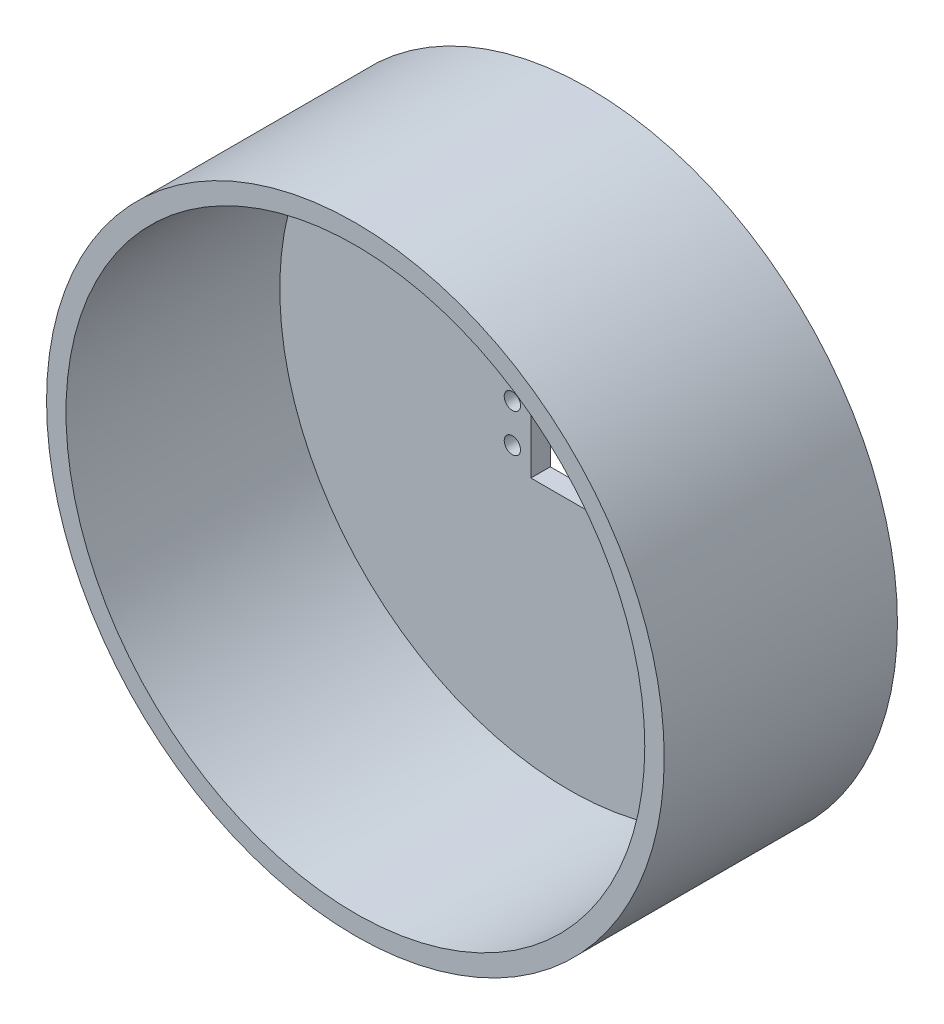
ISO-10303-21;
HEADER;
FILE_DESCRIPTION(('STEP AP214'),'2;1');
FILE_NAME('part.step','',(''),(''),'','','');
FILE_SCHEMA(('AUTOMOTIVE_DESIGN { 1 0 10303 214 1 1 1 1 }'));
ENDSEC;
DATA;
#1=APPLICATION_CONTEXT('core data for automotive mechanical design processes');
#2=APPLICATION_PROTOCOL_DEFINITION('international standard','automotive_design',2000,#1);
#3=PRODUCT_CONTEXT('',#1,'mechanical');
#4=PRODUCT('Part','Part','',(#3));
#5=PRODUCT_RELATED_PRODUCT_CATEGORY('part','',(#4));
#6=PRODUCT_DEFINITION_FORMATION('','',#4);
#7=PRODUCT_DEFINITION_CONTEXT('part definition',#1,'design');
#8=PRODUCT_DEFINITION('design','',#6,#7);
#9=PRODUCT_DEFINITION_SHAPE('','',#8);
#10=(LENGTH_UNIT() NAMED_UNIT(*) SI_UNIT(.MILLI.,.METRE.));
#11=(NAMED_UNIT(*) PLANE_ANGLE_UNIT() SI_UNIT($,.RADIAN.));
#12=(NAMED_UNIT(*) SI_UNIT($,.STERADIAN.) SOLID_ANGLE_UNIT());
#13=UNCERTAINTY_MEASURE_WITH_UNIT(LENGTH_MEASURE(1.E-05),#10,'distance_accuracy_value','');
#14=(GEOMETRIC_REPRESENTATION_CONTEXT(3) GLOBAL_UNCERTAINTY_ASSIGNED_CONTEXT((#13)) GLOBAL_UNIT_ASSIGNED_CONTEXT((#10,
#11,#12)) REPRESENTATION_CONTEXT('',''));
#15=CARTESIAN_POINT('',(0.,0.,0.));
#16=DIRECTION('',(0.,0.,1.));
#17=DIRECTION('',(1.,0.,0.));
#18=AXIS2_PLACEMENT_3D('',#15,#16,#17);
#19=CARTESIAN_POINT('',(0.,0.,60.));
#20=DIRECTION('',(0.,0.,-1.));
#21=DIRECTION('',(-1.,0.,0.));
#22=AXIS2_PLACEMENT_3D('',#19,#20,#21);
#23=CYLINDRICAL_SURFACE('',#22,79.45);
#24=CARTESIAN_POINT('',(0.,0.,60.));
#25=DIRECTION('',(0.,0.,1.));
#26=DIRECTION('',(1.,0.,0.));
#27=AXIS2_PLACEMENT_3D('',#24,#25,#26);
#28=CIRCLE('',#27,79.45);
#29=CARTESIAN_POINT('',(79.45,0.,60.));
#30=VERTEX_POINT('',#29);
#31=EDGE_CURVE('E115',#30,#30,#28,.T.);
#32=ORIENTED_EDGE('',*,*,#31,.F.);
#33=EDGE_LOOP('',(#32));
#34=FACE_BOUND('',#33,.T.);
#35=CARTESIAN_POINT('',(0.,0.,0.));
#36=DIRECTION('',(0.,0.,1.));
#37=DIRECTION('',(1.,0.,0.));
#38=AXIS2_PLACEMENT_3D('',#35,#36,#37);
#39=CIRCLE('',#38,79.45);
#40=CARTESIAN_POINT('',(79.45,0.,0.));
#41=VERTEX_POINT('',#40);
#42=EDGE_CURVE('E114',#41,#41,#39,.T.);
#43=ORIENTED_EDGE('',*,*,#42,.T.);
#44=EDGE_LOOP('',(#43));
#45=FACE_BOUND('',#44,.T.);
#46=ADVANCED_FACE('F38',(#34,#45),#23,.T.);
#47=CARTESIAN_POINT('',(0.,0.,60.));
#48=DIRECTION('',(0.,0.,1.));
#49=DIRECTION('',(1.,0.,0.));
#50=AXIS2_PLACEMENT_3D('',#47,#48,#49);
#51=PLANE('',#50);
#52=CARTESIAN_POINT('',(0.,0.,60.));
#53=DIRECTION('',(0.,0.,1.));
#54=DIRECTION('',(1.,0.,0.));
#55=AXIS2_PLACEMENT_3D('',#52,#53,#54);
#56=CIRCLE('',#55,74.45);
#57=CARTESIAN_POINT('',(74.45,0.,60.));
#58=VERTEX_POINT('',#57);
#59=EDGE_CURVE('E111',#58,#58,#56,.T.);
#60=ORIENTED_EDGE('',*,*,#59,.F.);
#61=EDGE_LOOP('',(#60));
#62=FACE_BOUND('',#61,.T.);
#63=ORIENTED_EDGE('',*,*,#31,.T.);
#64=EDGE_LOOP('',(#63));
#65=FACE_BOUND('',#64,.T.);
#66=ADVANCED_FACE('F161',(#62,#65),#51,.T.);
#67=CARTESIAN_POINT('',(0.,0.,0.));
#68=DIRECTION('',(0.,0.,1.));
#69=DIRECTION('',(1.,0.,0.));
#70=AXIS2_PLACEMENT_3D('',#67,#68,#69);
#71=PLANE('',#70);
#72=CARTESIAN_POINT('',(-14.611895649818,4.92277429801889,0.));
#73=DIRECTION('',(0.,0.,-1.));
#74=DIRECTION('',(-1.,0.,0.));
#75=AXIS2_PLACEMENT_3D('',#72,#73,#74);
#76=CIRCLE('',#75,2.10000000000001);
#77=CARTESIAN_POINT('',(-16.711895649818,4.92277429801889,0.));
#78=VERTEX_POINT('',#77);
#79=EDGE_CURVE('E276',#78,#78,#76,.T.);
#80=ORIENTED_EDGE('',*,*,#79,.F.);
#81=EDGE_LOOP('',(#80));
#82=FACE_BOUND('',#81,.T.);
#83=CARTESIAN_POINT('',(-14.6103952471607,-4.92722558770659,0.));
#84=DIRECTION('',(0.,0.,-1.));
#85=DIRECTION('',(-1.,0.,0.));
#86=AXIS2_PLACEMENT_3D('',#83,#84,#85);
#87=CIRCLE('',#86,2.10000000000001);
#88=CARTESIAN_POINT('',(-16.7103952471607,-4.92722558770659,0.));
#89=VERTEX_POINT('',#88);
#90=EDGE_CURVE('E273',#89,#89,#87,.T.);
#91=ORIENTED_EDGE('',*,*,#90,.F.);
#92=EDGE_LOOP('',(#91));
#93=FACE_BOUND('',#92,.T.);
#94=CARTESIAN_POINT('',(34.8118954154682,-4.91969733013279,0.));
#95=DIRECTION('',(0.,0.,-1.));
#96=DIRECTION('',(-1.,0.,0.));
#97=AXIS2_PLACEMENT_3D('',#94,#95,#96);
#98=CIRCLE('',#97,2.10000000000001);
#99=CARTESIAN_POINT('',(32.7118954154681,-4.91969733013279,0.));
#100=VERTEX_POINT('',#99);
#101=EDGE_CURVE('E275',#100,#100,#98,.T.);
#102=ORIENTED_EDGE('',*,*,#101,.F.);
#103=EDGE_LOOP('',(#102));
#104=FACE_BOUND('',#103,.T.);
#105=CARTESIAN_POINT('',(34.8103950128108,4.93030255559268,0.));
#106=DIRECTION('',(0.,0.,-1.));
#107=DIRECTION('',(-1.,0.,0.));
#108=AXIS2_PLACEMENT_3D('',#105,#106,#107);
#109=CIRCLE('',#108,2.10000000000001);
#110=CARTESIAN_POINT('',(32.7103950128108,4.93030255559268,0.));
#111=VERTEX_POINT('',#110);
#112=EDGE_CURVE('E279',#111,#111,#109,.T.);
#113=ORIENTED_EDGE('',*,*,#112,.F.);
#114=EDGE_LOOP('',(#113));
#115=FACE_BOUND('',#114,.T.);
#116=DIRECTION('',(-0.999999988398525,-0.000152325142876257,0.));
#117=VECTOR('',#116,1.);
#118=CARTESIAN_POINT('',(-9.85145459083999,-9.85150073852003,0.));
#119=LINE('',#118,#117);
#120=CARTESIAN_POINT('',(30.051500054033,-9.84542251518205,0.));
#121=VERTEX_POINT('',#120);
#122=CARTESIAN_POINT('',(-9.85145459083999,-9.85150073852003,0.));
#123=VERTEX_POINT('',#122);
#124=EDGE_CURVE('E91',#121,#123,#119,.T.);
#125=ORIENTED_EDGE('',*,*,#124,.F.);
#126=DIRECTION('',(0.000152325142875524,-0.999999988398525,0.));
#127=VECTOR('',#126,1.);
#128=CARTESIAN_POINT('',(30.051500054033,-9.84542251518205,0.));
#129=LINE('',#128,#127);
#130=CARTESIAN_POINT('',(30.0484992487183,9.8545772562689,0.));
#131=VERTEX_POINT('',#130);
#132=EDGE_CURVE('E54',#131,#121,#129,.T.);
#133=ORIENTED_EDGE('',*,*,#132,.F.);
#134=DIRECTION('',(0.999999988398525,0.0001523251428762,0.));
#135=VECTOR('',#134,1.);
#136=CARTESIAN_POINT('',(30.0484992487183,9.8545772562689,0.));
#137=LINE('',#136,#135);
#138=CARTESIAN_POINT('',(-9.85145459083999,9.84849949002903,0.));
#139=VERTEX_POINT('',#138);
#140=EDGE_CURVE('E98',#139,#131,#137,.T.);
#141=ORIENTED_EDGE('',*,*,#140,.F.);
#142=DIRECTION('',(0.,1.,0.));
#143=VECTOR('',#142,1.);
#144=CARTESIAN_POINT('',(-9.85145459083999,9.84849949002903,0.));
#145=LINE('',#144,#143);
#146=EDGE_CURVE('E82',#123,#139,#145,.T.);
#147=ORIENTED_EDGE('',*,*,#146,.F.);
#148=EDGE_LOOP('',(#125,#133,#141,#147));
#149=FACE_BOUND('',#148,.T.);
#150=ORIENTED_EDGE('',*,*,#42,.F.);
#151=EDGE_LOOP('',(#150));
#152=FACE_BOUND('',#151,.T.);
#153=ADVANCED_FACE('F95',(#82,#93,#104,#115,#149,#152),#71,.F.);
#154=CARTESIAN_POINT('',(0.,0.,60.));
#155=DIRECTION('',(0.,0.,-1.));
#156=DIRECTION('',(-1.,0.,0.));
#157=AXIS2_PLACEMENT_3D('',#154,#155,#156);
#158=CYLINDRICAL_SURFACE('',#157,74.45);
#159=ORIENTED_EDGE('',*,*,#59,.T.);
#160=EDGE_LOOP('',(#159));
#161=FACE_BOUND('',#160,.T.);
#162=CARTESIAN_POINT('',(0.,0.,5.));
#163=DIRECTION('',(0.,0.,1.));
#164=DIRECTION('',(1.,0.,0.));
#165=AXIS2_PLACEMENT_3D('',#162,#163,#164);
#166=CIRCLE('',#165,74.45);
#167=CARTESIAN_POINT('',(74.45,0.,5.));
#168=VERTEX_POINT('',#167);
#169=EDGE_CURVE('E108',#168,#168,#166,.T.);
#170=ORIENTED_EDGE('',*,*,#169,.F.);
#171=EDGE_LOOP('',(#170));
#172=FACE_BOUND('',#171,.T.);
#173=ADVANCED_FACE('F142',(#161,#172),#158,.F.);
#174=CARTESIAN_POINT('',(0.,0.,5.));
#175=DIRECTION('',(0.,0.,1.));
#176=DIRECTION('',(1.,0.,0.));
#177=AXIS2_PLACEMENT_3D('',#174,#175,#176);
#178=PLANE('',#177);
#179=CARTESIAN_POINT('',(-14.611895649818,4.92277429801889,5.));
#180=DIRECTION('',(0.,0.,1.));
#181=DIRECTION('',(1.,0.,0.));
#182=AXIS2_PLACEMENT_3D('',#179,#180,#181);
#183=CIRCLE('',#182,2.10000000000001);
#184=CARTESIAN_POINT('',(-12.511895649818,4.92277429801889,5.));
#185=VERTEX_POINT('',#184);
#186=EDGE_CURVE('E41',#185,#185,#183,.T.);
#187=ORIENTED_EDGE('',*,*,#186,.F.);
#188=EDGE_LOOP('',(#187));
#189=FACE_BOUND('',#188,.T.);
#190=CARTESIAN_POINT('',(-14.6103952471607,-4.92722558770659,5.));
#191=DIRECTION('',(0.,0.,1.));
#192=DIRECTION('',(1.,0.,0.));
#193=AXIS2_PLACEMENT_3D('',#190,#191,#192);
#194=CIRCLE('',#193,2.10000000000001);
#195=CARTESIAN_POINT('',(-12.5103952471607,-4.92722558770659,5.));
#196=VERTEX_POINT('',#195);
#197=EDGE_CURVE('E128',#196,#196,#194,.T.);
#198=ORIENTED_EDGE('',*,*,#197,.F.);
#199=EDGE_LOOP('',(#198));
#200=FACE_BOUND('',#199,.T.);
#201=CARTESIAN_POINT('',(34.8118954154682,-4.91969733013279,5.));
#202=DIRECTION('',(0.,0.,1.));
#203=DIRECTION('',(1.,0.,0.));
#204=AXIS2_PLACEMENT_3D('',#201,#202,#203);
#205=CIRCLE('',#204,2.10000000000001);
#206=CARTESIAN_POINT('',(36.9118954154682,-4.91969733013279,5.));
#207=VERTEX_POINT('',#206);
#208=EDGE_CURVE('E126',#207,#207,#205,.T.);
#209=ORIENTED_EDGE('',*,*,#208,.F.);
#210=EDGE_LOOP('',(#209));
#211=FACE_BOUND('',#210,.T.);
#212=CARTESIAN_POINT('',(34.8103950128108,4.93030255559268,5.));
#213=DIRECTION('',(0.,0.,1.));
#214=DIRECTION('',(1.,0.,0.));
#215=AXIS2_PLACEMENT_3D('',#212,#213,#214);
#216=CIRCLE('',#215,2.10000000000001);
#217=CARTESIAN_POINT('',(36.9103950128108,4.93030255559268,5.));
#218=VERTEX_POINT('',#217);
#219=EDGE_CURVE('E105',#218,#218,#216,.T.);
#220=ORIENTED_EDGE('',*,*,#219,.F.);
#221=EDGE_LOOP('',(#220));
#222=FACE_BOUND('',#221,.T.);
#223=DIRECTION('',(-0.000152325142875524,0.999999988398525,0.));
#224=VECTOR('',#223,1.);
#225=CARTESIAN_POINT('',(30.0499996513756,0.0045773705434095,5.));
#226=LINE('',#225,#224);
#227=CARTESIAN_POINT('',(30.051500054033,-9.84542251518205,5.));
#228=VERTEX_POINT('',#227);
#229=CARTESIAN_POINT('',(30.0484992487183,9.8545772562689,5.));
#230=VERTEX_POINT('',#229);
#231=EDGE_CURVE('E11',#228,#230,#226,.T.);
#232=ORIENTED_EDGE('',*,*,#231,.F.);
#233=DIRECTION('',(0.999999988398525,0.000152325142876257,0.));
#234=VECTOR('',#233,1.);
#235=CARTESIAN_POINT('',(0.00150040265733113,-9.84999988572548,5.));
#236=LINE('',#235,#234);
#237=CARTESIAN_POINT('',(-9.85145459083999,-9.85150073852003,5.));
#238=VERTEX_POINT('',#237);
#239=EDGE_CURVE('E118',#238,#228,#236,.T.);
#240=ORIENTED_EDGE('',*,*,#239,.F.);
#241=DIRECTION('',(0.,-1.,0.));
#242=VECTOR('',#241,1.);
#243=CARTESIAN_POINT('',(-9.85145459083999,0.,5.));
#244=LINE('',#243,#242);
#245=CARTESIAN_POINT('',(-9.85145459083999,9.84849949002903,5.));
#246=VERTEX_POINT('',#245);
#247=EDGE_CURVE('E85',#246,#238,#244,.T.);
#248=ORIENTED_EDGE('',*,*,#247,.F.);
#249=DIRECTION('',(-0.999999988398526,-0.0001523251428762,0.));
#250=VECTOR('',#249,1.);
#251=CARTESIAN_POINT('',(-0.00150040265733056,9.84999988572547,5.));
#252=LINE('',#251,#250);
#253=EDGE_CURVE('E46',#230,#246,#252,.T.);
#254=ORIENTED_EDGE('',*,*,#253,.F.);
#255=EDGE_LOOP('',(#232,#240,#248,#254));
#256=FACE_BOUND('',#255,.T.);
#257=ORIENTED_EDGE('',*,*,#169,.T.);
#258=EDGE_LOOP('',(#257));
#259=FACE_BOUND('',#258,.T.);
#260=ADVANCED_FACE('F138',(#189,#200,#211,#222,#256,#259),#178,.T.);
#261=CARTESIAN_POINT('',(30.051500054033,-9.84542251518205,60.));
#262=DIRECTION('',(0.999999988398525,0.000152325142875524,0.));
#263=DIRECTION('',(-0.000152325142875524,0.999999988398525,0.));
#264=AXIS2_PLACEMENT_3D('',#261,#262,#263);
#265=PLANE('',#264);
#266=ORIENTED_EDGE('',*,*,#231,.T.);
#267=DIRECTION('',(0.,0.,-1.));
#268=VECTOR('',#267,1.);
#269=CARTESIAN_POINT('',(30.0484992487183,9.8545772562689,60.));
#270=LINE('',#269,#268);
#271=EDGE_CURVE('E103',#230,#131,#270,.T.);
#272=ORIENTED_EDGE('',*,*,#271,.T.);
#273=ORIENTED_EDGE('',*,*,#132,.T.);
#274=DIRECTION('',(0.,0.,-1.));
#275=VECTOR('',#274,1.);
#276=CARTESIAN_POINT('',(30.051500054033,-9.84542251518205,60.));
#277=LINE('',#276,#275);
#278=EDGE_CURVE('E88',#228,#121,#277,.T.);
#279=ORIENTED_EDGE('',*,*,#278,.F.);
#280=EDGE_LOOP('',(#266,#272,#273,#279));
#281=FACE_BOUND('',#280,.T.);
#282=ADVANCED_FACE('F141',(#281),#265,.F.);
#283=CARTESIAN_POINT('',(30.0484992487183,9.8545772562689,60.));
#284=DIRECTION('',(-0.0001523251428762,0.999999988398525,0.));
#285=DIRECTION('',(-0.999999988398526,-0.0001523251428762,0.));
#286=AXIS2_PLACEMENT_3D('',#283,#284,#285);
#287=PLANE('',#286);
#288=ORIENTED_EDGE('',*,*,#253,.T.);
#289=DIRECTION('',(0.,0.,-1.));
#290=VECTOR('',#289,1.);
#291=CARTESIAN_POINT('',(-9.85145459083999,9.84849949002903,60.));
#292=LINE('',#291,#290);
#293=EDGE_CURVE('E87',#246,#139,#292,.T.);
#294=ORIENTED_EDGE('',*,*,#293,.T.);
#295=ORIENTED_EDGE('',*,*,#140,.T.);
#296=ORIENTED_EDGE('',*,*,#271,.F.);
#297=EDGE_LOOP('',(#288,#294,#295,#296));
#298=FACE_BOUND('',#297,.T.);
#299=ADVANCED_FACE('F206',(#298),#287,.F.);
#300=CARTESIAN_POINT('',(-9.85145459083999,9.84849949002903,60.));
#301=DIRECTION('',(-1.,0.,0.));
#302=DIRECTION('',(0.,0.,1.));
#303=AXIS2_PLACEMENT_3D('',#300,#301,#302);
#304=PLANE('',#303);
#305=ORIENTED_EDGE('',*,*,#247,.T.);
#306=DIRECTION('',(0.,0.,-1.));
#307=VECTOR('',#306,1.);
#308=CARTESIAN_POINT('',(-9.85145459083999,-9.85150073852003,60.));
#309=LINE('',#308,#307);
#310=EDGE_CURVE('E62',#238,#123,#309,.T.);
#311=ORIENTED_EDGE('',*,*,#310,.T.);
#312=ORIENTED_EDGE('',*,*,#146,.T.);
#313=ORIENTED_EDGE('',*,*,#293,.F.);
#314=EDGE_LOOP('',(#305,#311,#312,#313));
#315=FACE_BOUND('',#314,.T.);
#316=ADVANCED_FACE('F79',(#315),#304,.F.);
#317=CARTESIAN_POINT('',(-9.85145459083999,-9.85150073852003,60.));
#318=DIRECTION('',(0.000152325142876257,-0.999999988398525,0.));
#319=DIRECTION('',(0.999999988398525,0.000152325142876257,0.));
#320=AXIS2_PLACEMENT_3D('',#317,#318,#319);
#321=PLANE('',#320);
#322=ORIENTED_EDGE('',*,*,#239,.T.);
#323=ORIENTED_EDGE('',*,*,#278,.T.);
#324=ORIENTED_EDGE('',*,*,#124,.T.);
#325=ORIENTED_EDGE('',*,*,#310,.F.);
#326=EDGE_LOOP('',(#322,#323,#324,#325));
#327=FACE_BOUND('',#326,.T.);
#328=ADVANCED_FACE('F92',(#327),#321,.F.);
#329=CARTESIAN_POINT('',(34.8103950128108,4.93030255559268,60.));
#330=DIRECTION('',(0.,0.,-1.));
#331=DIRECTION('',(-1.,0.,0.));
#332=AXIS2_PLACEMENT_3D('',#329,#330,#331);
#333=CYLINDRICAL_SURFACE('',#332,2.10000000000001);
#334=ORIENTED_EDGE('',*,*,#219,.T.);
#335=EDGE_LOOP('',(#334));
#336=FACE_BOUND('',#335,.T.);
#337=ORIENTED_EDGE('',*,*,#112,.T.);
#338=EDGE_LOOP('',(#337));
#339=FACE_BOUND('',#338,.T.);
#340=ADVANCED_FACE('F231',(#336,#339),#333,.F.);
#341=CARTESIAN_POINT('',(34.8118954154682,-4.91969733013279,60.));
#342=DIRECTION('',(0.,0.,-1.));
#343=DIRECTION('',(-1.,0.,0.));
#344=AXIS2_PLACEMENT_3D('',#341,#342,#343);
#345=CYLINDRICAL_SURFACE('',#344,2.10000000000001);
#346=ORIENTED_EDGE('',*,*,#208,.T.);
#347=EDGE_LOOP('',(#346));
#348=FACE_BOUND('',#347,.T.);
#349=ORIENTED_EDGE('',*,*,#101,.T.);
#350=EDGE_LOOP('',(#349));
#351=FACE_BOUND('',#350,.T.);
#352=ADVANCED_FACE('F240',(#348,#351),#345,.F.);
#353=CARTESIAN_POINT('',(-14.6103952471607,-4.92722558770659,60.));
#354=DIRECTION('',(0.,0.,-1.));
#355=DIRECTION('',(-1.,0.,0.));
#356=AXIS2_PLACEMENT_3D('',#353,#354,#355);
#357=CYLINDRICAL_SURFACE('',#356,2.10000000000001);
#358=ORIENTED_EDGE('',*,*,#197,.T.);
#359=EDGE_LOOP('',(#358));
#360=FACE_BOUND('',#359,.T.);
#361=ORIENTED_EDGE('',*,*,#90,.T.);
#362=EDGE_LOOP('',(#361));
#363=FACE_BOUND('',#362,.T.);
#364=ADVANCED_FACE('F250',(#360,#363),#357,.F.);
#365=CARTESIAN_POINT('',(-14.611895649818,4.92277429801889,60.));
#366=DIRECTION('',(0.,0.,-1.));
#367=DIRECTION('',(-1.,0.,0.));
#368=AXIS2_PLACEMENT_3D('',#365,#366,#367);
#369=CYLINDRICAL_SURFACE('',#368,2.10000000000001);
#370=ORIENTED_EDGE('',*,*,#186,.T.);
#371=EDGE_LOOP('',(#370));
#372=FACE_BOUND('',#371,.T.);
#373=ORIENTED_EDGE('',*,*,#79,.T.);
#374=EDGE_LOOP('',(#373));
#375=FACE_BOUND('',#374,.T.);
#376=ADVANCED_FACE('F135',(#372,#375),#369,.F.);
#377=CLOSED_SHELL('',(#46,#66,#153,#173,#260,#282,#299,#316,#328,#340,#352,#364,#376));
#378=MANIFOLD_SOLID_BREP('B2',#377);
#379=ADVANCED_BREP_SHAPE_REPRESENTATION('',(#18,#378),#14);
#380=SHAPE_DEFINITION_REPRESENTATION(#9,#379);
ENDSEC;
END-ISO-10303-21;
